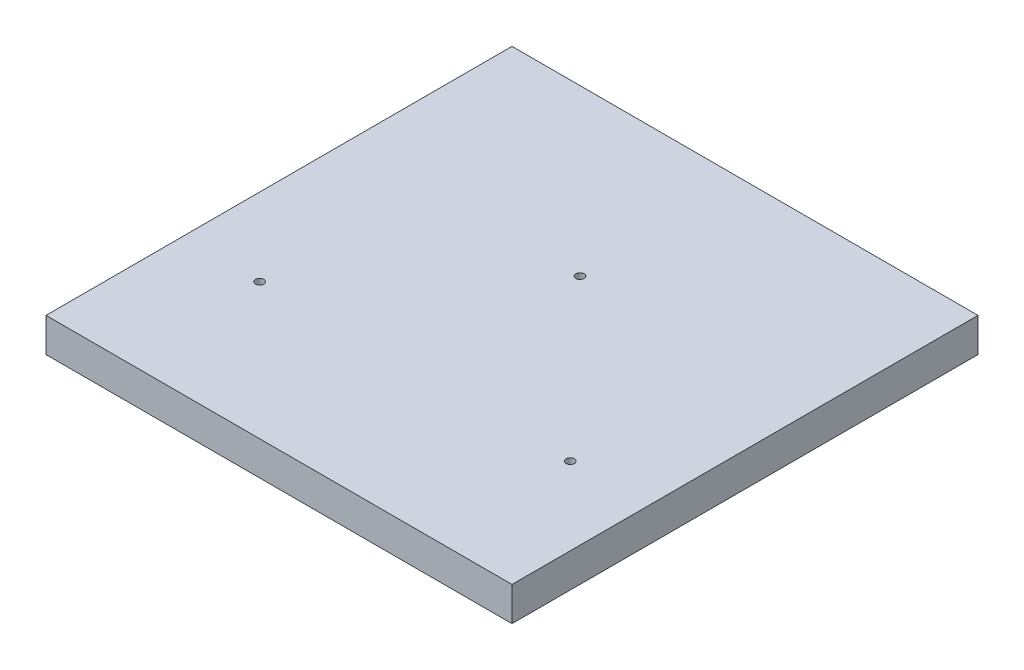
ISO-10303-21;
HEADER;
FILE_DESCRIPTION(('STEP AP214'),'2;1');
FILE_NAME('part.step','',(''),(''),'','','');
FILE_SCHEMA(('AUTOMOTIVE_DESIGN { 1 0 10303 214 1 1 1 1 }'));
ENDSEC;
DATA;
#1=APPLICATION_CONTEXT('core data for automotive mechanical design processes');
#2=APPLICATION_PROTOCOL_DEFINITION('international standard','automotive_design',2000,#1);
#3=PRODUCT_CONTEXT('',#1,'mechanical');
#4=PRODUCT('Part','Part','',(#3));
#5=PRODUCT_RELATED_PRODUCT_CATEGORY('part','',(#4));
#6=PRODUCT_DEFINITION_FORMATION('','',#4);
#7=PRODUCT_DEFINITION_CONTEXT('part definition',#1,'design');
#8=PRODUCT_DEFINITION('design','',#6,#7);
#9=PRODUCT_DEFINITION_SHAPE('','',#8);
#10=(LENGTH_UNIT() NAMED_UNIT(*) SI_UNIT(.MILLI.,.METRE.));
#11=(NAMED_UNIT(*) PLANE_ANGLE_UNIT() SI_UNIT($,.RADIAN.));
#12=(NAMED_UNIT(*) SI_UNIT($,.STERADIAN.) SOLID_ANGLE_UNIT());
#13=UNCERTAINTY_MEASURE_WITH_UNIT(LENGTH_MEASURE(1.E-05),#10,'distance_accuracy_value','');
#14=(GEOMETRIC_REPRESENTATION_CONTEXT(3) GLOBAL_UNCERTAINTY_ASSIGNED_CONTEXT((#13)) GLOBAL_UNIT_ASSIGNED_CONTEXT((#10,
#11,#12)) REPRESENTATION_CONTEXT('',''));
#15=CARTESIAN_POINT('',(0.,0.,0.));
#16=DIRECTION('',(0.,0.,1.));
#17=DIRECTION('',(1.,0.,0.));
#18=AXIS2_PLACEMENT_3D('',#15,#16,#17);
#19=CARTESIAN_POINT('',(-76.2,-5.55625,76.2));
#20=DIRECTION('',(1.,0.,0.));
#21=DIRECTION('',(0.,0.,-1.));
#22=AXIS2_PLACEMENT_3D('',#19,#20,#21);
#23=PLANE('',#22);
#24=DIRECTION('',(0.,-1.,0.));
#25=VECTOR('',#24,1.);
#26=CARTESIAN_POINT('',(-76.2,-5.55625,-76.2));
#27=LINE('',#26,#25);
#28=CARTESIAN_POINT('',(-76.2,5.55625,-76.2));
#29=VERTEX_POINT('',#28);
#30=CARTESIAN_POINT('',(-76.2,-5.55625,-76.2));
#31=VERTEX_POINT('',#30);
#32=EDGE_CURVE('E118',#29,#31,#27,.T.);
#33=ORIENTED_EDGE('',*,*,#32,.T.);
#34=DIRECTION('',(0.,0.,-1.));
#35=VECTOR('',#34,1.);
#36=CARTESIAN_POINT('',(-76.2,-5.55625,76.2));
#37=LINE('',#36,#35);
#38=CARTESIAN_POINT('',(-76.2,-5.55625,76.2));
#39=VERTEX_POINT('',#38);
#40=EDGE_CURVE('E11',#39,#31,#37,.T.);
#41=ORIENTED_EDGE('',*,*,#40,.F.);
#42=DIRECTION('',(0.,-1.,0.));
#43=VECTOR('',#42,1.);
#44=CARTESIAN_POINT('',(-76.2,-5.55625,76.2));
#45=LINE('',#44,#43);
#46=CARTESIAN_POINT('',(-76.2,5.55625,76.2));
#47=VERTEX_POINT('',#46);
#48=EDGE_CURVE('E102',#47,#39,#45,.T.);
#49=ORIENTED_EDGE('',*,*,#48,.F.);
#50=DIRECTION('',(0.,0.,-1.));
#51=VECTOR('',#50,1.);
#52=CARTESIAN_POINT('',(-76.2,5.55625,76.2));
#53=LINE('',#52,#51);
#54=EDGE_CURVE('E114',#47,#29,#53,.T.);
#55=ORIENTED_EDGE('',*,*,#54,.T.);
#56=EDGE_LOOP('',(#33,#41,#49,#55));
#57=FACE_BOUND('',#56,.T.);
#58=ADVANCED_FACE('F50',(#57),#23,.F.);
#59=CARTESIAN_POINT('',(76.2,-5.55625,76.2));
#60=DIRECTION('',(0.,1.,0.));
#61=DIRECTION('',(0.,0.,1.));
#62=AXIS2_PLACEMENT_3D('',#59,#60,#61);
#63=PLANE('',#62);
#64=CARTESIAN_POINT('',(0.,-5.55625,-22.2235425877767));
#65=DIRECTION('',(0.,1.,0.));
#66=DIRECTION('',(0.,0.,1.));
#67=AXIS2_PLACEMENT_3D('',#64,#65,#66);
#68=CIRCLE('',#67,1.35255);
#69=CARTESIAN_POINT('',(0.,-5.55625,-20.8709925877767));
#70=VERTEX_POINT('',#69);
#71=EDGE_CURVE('E154',#70,#70,#68,.T.);
#72=ORIENTED_EDGE('',*,*,#71,.T.);
#73=EDGE_LOOP('',(#72));
#74=FACE_BOUND('',#73,.T.);
#75=CARTESIAN_POINT('',(50.7999999999999,-5.55625,31.75));
#76=DIRECTION('',(0.,1.,0.));
#77=DIRECTION('',(0.,0.,1.));
#78=AXIS2_PLACEMENT_3D('',#75,#76,#77);
#79=CIRCLE('',#78,1.35254999999999);
#80=CARTESIAN_POINT('',(50.7999999999999,-5.55625,33.10255));
#81=VERTEX_POINT('',#80);
#82=EDGE_CURVE('E146',#81,#81,#79,.T.);
#83=ORIENTED_EDGE('',*,*,#82,.T.);
#84=EDGE_LOOP('',(#83));
#85=FACE_BOUND('',#84,.T.);
#86=CARTESIAN_POINT('',(-50.8000000000001,-5.55625,31.75));
#87=DIRECTION('',(0.,1.,0.));
#88=DIRECTION('',(0.,0.,1.));
#89=AXIS2_PLACEMENT_3D('',#86,#87,#88);
#90=CIRCLE('',#89,1.35254999999999);
#91=CARTESIAN_POINT('',(-50.8000000000001,-5.55625,33.10255));
#92=VERTEX_POINT('',#91);
#93=EDGE_CURVE('E122',#92,#92,#90,.T.);
#94=ORIENTED_EDGE('',*,*,#93,.T.);
#95=EDGE_LOOP('',(#94));
#96=FACE_BOUND('',#95,.T.);
#97=DIRECTION('',(1.,0.,0.));
#98=VECTOR('',#97,1.);
#99=CARTESIAN_POINT('',(76.2,-5.55625,-76.2));
#100=LINE('',#99,#98);
#101=CARTESIAN_POINT('',(76.2,-5.55625,-76.2));
#102=VERTEX_POINT('',#101);
#103=EDGE_CURVE('E107',#31,#102,#100,.T.);
#104=ORIENTED_EDGE('',*,*,#103,.T.);
#105=DIRECTION('',(0.,0.,-1.));
#106=VECTOR('',#105,1.);
#107=CARTESIAN_POINT('',(76.2,-5.55625,76.2));
#108=LINE('',#107,#106);
#109=CARTESIAN_POINT('',(76.2,-5.55625,76.2));
#110=VERTEX_POINT('',#109);
#111=EDGE_CURVE('E59',#110,#102,#108,.T.);
#112=ORIENTED_EDGE('',*,*,#111,.F.);
#113=DIRECTION('',(1.,0.,0.));
#114=VECTOR('',#113,1.);
#115=CARTESIAN_POINT('',(76.2,-5.55625,76.2));
#116=LINE('',#115,#114);
#117=EDGE_CURVE('E97',#39,#110,#116,.T.);
#118=ORIENTED_EDGE('',*,*,#117,.F.);
#119=ORIENTED_EDGE('',*,*,#40,.T.);
#120=EDGE_LOOP('',(#104,#112,#118,#119));
#121=FACE_BOUND('',#120,.T.);
#122=ADVANCED_FACE('F106',(#74,#85,#96,#121),#63,.F.);
#123=CARTESIAN_POINT('',(76.2,5.55625,76.2));
#124=DIRECTION('',(-1.,0.,0.));
#125=DIRECTION('',(0.,0.,1.));
#126=AXIS2_PLACEMENT_3D('',#123,#124,#125);
#127=PLANE('',#126);
#128=DIRECTION('',(0.,1.,0.));
#129=VECTOR('',#128,1.);
#130=CARTESIAN_POINT('',(76.2,5.55625,-76.2));
#131=LINE('',#130,#129);
#132=CARTESIAN_POINT('',(76.2,5.55625,-76.2));
#133=VERTEX_POINT('',#132);
#134=EDGE_CURVE('E84',#102,#133,#131,.T.);
#135=ORIENTED_EDGE('',*,*,#134,.T.);
#136=DIRECTION('',(0.,0.,-1.));
#137=VECTOR('',#136,1.);
#138=CARTESIAN_POINT('',(76.2,5.55625,76.2));
#139=LINE('',#138,#137);
#140=CARTESIAN_POINT('',(76.2,5.55625,76.2));
#141=VERTEX_POINT('',#140);
#142=EDGE_CURVE('E109',#141,#133,#139,.T.);
#143=ORIENTED_EDGE('',*,*,#142,.F.);
#144=DIRECTION('',(0.,1.,0.));
#145=VECTOR('',#144,1.);
#146=CARTESIAN_POINT('',(76.2,5.55625,76.2));
#147=LINE('',#146,#145);
#148=EDGE_CURVE('E100',#110,#141,#147,.T.);
#149=ORIENTED_EDGE('',*,*,#148,.F.);
#150=ORIENTED_EDGE('',*,*,#111,.T.);
#151=EDGE_LOOP('',(#135,#143,#149,#150));
#152=FACE_BOUND('',#151,.T.);
#153=ADVANCED_FACE('F110',(#152),#127,.F.);
#154=CARTESIAN_POINT('',(-76.2,5.55625,76.2));
#155=DIRECTION('',(0.,-1.,0.));
#156=DIRECTION('',(0.,0.,-1.));
#157=AXIS2_PLACEMENT_3D('',#154,#155,#156);
#158=PLANE('',#157);
#159=CARTESIAN_POINT('',(0.,5.55625,-22.2235425877767));
#160=DIRECTION('',(0.,1.,0.));
#161=DIRECTION('',(0.,0.,1.));
#162=AXIS2_PLACEMENT_3D('',#159,#160,#161);
#163=CIRCLE('',#162,1.35255);
#164=CARTESIAN_POINT('',(0.,5.55625,-20.8709925877767));
#165=VERTEX_POINT('',#164);
#166=EDGE_CURVE('E158',#165,#165,#163,.T.);
#167=ORIENTED_EDGE('',*,*,#166,.F.);
#168=EDGE_LOOP('',(#167));
#169=FACE_BOUND('',#168,.T.);
#170=CARTESIAN_POINT('',(50.7999999999999,5.55625,31.75));
#171=DIRECTION('',(0.,1.,0.));
#172=DIRECTION('',(0.,0.,1.));
#173=AXIS2_PLACEMENT_3D('',#170,#171,#172);
#174=CIRCLE('',#173,1.35255);
#175=CARTESIAN_POINT('',(50.7999999999999,5.55625,33.10255));
#176=VERTEX_POINT('',#175);
#177=EDGE_CURVE('E150',#176,#176,#174,.T.);
#178=ORIENTED_EDGE('',*,*,#177,.F.);
#179=EDGE_LOOP('',(#178));
#180=FACE_BOUND('',#179,.T.);
#181=CARTESIAN_POINT('',(-50.8000000000001,5.55625,31.75));
#182=DIRECTION('',(0.,1.,0.));
#183=DIRECTION('',(0.,0.,1.));
#184=AXIS2_PLACEMENT_3D('',#181,#182,#183);
#185=CIRCLE('',#184,1.35255);
#186=CARTESIAN_POINT('',(-50.8000000000001,5.55625,33.10255));
#187=VERTEX_POINT('',#186);
#188=EDGE_CURVE('E142',#187,#187,#185,.T.);
#189=ORIENTED_EDGE('',*,*,#188,.F.);
#190=EDGE_LOOP('',(#189));
#191=FACE_BOUND('',#190,.T.);
#192=DIRECTION('',(-1.,0.,0.));
#193=VECTOR('',#192,1.);
#194=CARTESIAN_POINT('',(-76.2,5.55625,-76.2));
#195=LINE('',#194,#193);
#196=EDGE_CURVE('E90',#133,#29,#195,.T.);
#197=ORIENTED_EDGE('',*,*,#196,.T.);
#198=ORIENTED_EDGE('',*,*,#54,.F.);
#199=DIRECTION('',(-1.,0.,0.));
#200=VECTOR('',#199,1.);
#201=CARTESIAN_POINT('',(-76.2,5.55625,76.2));
#202=LINE('',#201,#200);
#203=EDGE_CURVE('E67',#141,#47,#202,.T.);
#204=ORIENTED_EDGE('',*,*,#203,.F.);
#205=ORIENTED_EDGE('',*,*,#142,.T.);
#206=EDGE_LOOP('',(#197,#198,#204,#205));
#207=FACE_BOUND('',#206,.T.);
#208=ADVANCED_FACE('F132',(#169,#180,#191,#207),#158,.F.);
#209=CARTESIAN_POINT('',(0.,0.,76.2));
#210=DIRECTION('',(0.,0.,-1.));
#211=DIRECTION('',(-1.,0.,0.));
#212=AXIS2_PLACEMENT_3D('',#209,#210,#211);
#213=PLANE('',#212);
#214=ORIENTED_EDGE('',*,*,#48,.T.);
#215=ORIENTED_EDGE('',*,*,#117,.T.);
#216=ORIENTED_EDGE('',*,*,#148,.T.);
#217=ORIENTED_EDGE('',*,*,#203,.T.);
#218=EDGE_LOOP('',(#214,#215,#216,#217));
#219=FACE_BOUND('',#218,.T.);
#220=ADVANCED_FACE('F98',(#219),#213,.F.);
#221=CARTESIAN_POINT('',(0.,0.,-76.2));
#222=DIRECTION('',(0.,0.,-1.));
#223=DIRECTION('',(-1.,0.,0.));
#224=AXIS2_PLACEMENT_3D('',#221,#222,#223);
#225=PLANE('',#224);
#226=ORIENTED_EDGE('',*,*,#32,.F.);
#227=ORIENTED_EDGE('',*,*,#196,.F.);
#228=ORIENTED_EDGE('',*,*,#134,.F.);
#229=ORIENTED_EDGE('',*,*,#103,.F.);
#230=EDGE_LOOP('',(#226,#227,#228,#229));
#231=FACE_BOUND('',#230,.T.);
#232=ADVANCED_FACE('F135',(#231),#225,.T.);
#233=CARTESIAN_POINT('',(-50.8000000000001,5.55625,31.75));
#234=DIRECTION('',(0.,1.,0.));
#235=DIRECTION('',(0.,0.,1.));
#236=AXIS2_PLACEMENT_3D('',#233,#234,#235);
#237=CYLINDRICAL_SURFACE('',#236,1.35255);
#238=ORIENTED_EDGE('',*,*,#93,.F.);
#239=EDGE_LOOP('',(#238));
#240=FACE_BOUND('',#239,.T.);
#241=ORIENTED_EDGE('',*,*,#188,.T.);
#242=EDGE_LOOP('',(#241));
#243=FACE_BOUND('',#242,.T.);
#244=ADVANCED_FACE('F172',(#240,#243),#237,.F.);
#245=CARTESIAN_POINT('',(50.7999999999999,5.55625,31.75));
#246=DIRECTION('',(0.,1.,0.));
#247=DIRECTION('',(0.,0.,1.));
#248=AXIS2_PLACEMENT_3D('',#245,#246,#247);
#249=CYLINDRICAL_SURFACE('',#248,1.35255);
#250=ORIENTED_EDGE('',*,*,#82,.F.);
#251=EDGE_LOOP('',(#250));
#252=FACE_BOUND('',#251,.T.);
#253=ORIENTED_EDGE('',*,*,#177,.T.);
#254=EDGE_LOOP('',(#253));
#255=FACE_BOUND('',#254,.T.);
#256=ADVANCED_FACE('F174',(#252,#255),#249,.F.);
#257=CARTESIAN_POINT('',(0.,5.55625,-22.2235425877767));
#258=DIRECTION('',(0.,1.,0.));
#259=DIRECTION('',(0.,0.,1.));
#260=AXIS2_PLACEMENT_3D('',#257,#258,#259);
#261=CYLINDRICAL_SURFACE('',#260,1.35255);
#262=ORIENTED_EDGE('',*,*,#71,.F.);
#263=EDGE_LOOP('',(#262));
#264=FACE_BOUND('',#263,.T.);
#265=ORIENTED_EDGE('',*,*,#166,.T.);
#266=EDGE_LOOP('',(#265));
#267=FACE_BOUND('',#266,.T.);
#268=ADVANCED_FACE('F163',(#264,#267),#261,.F.);
#269=CLOSED_SHELL('',(#58,#122,#153,#208,#220,#232,#244,#256,#268));
#270=MANIFOLD_SOLID_BREP('B2',#269);
#271=ADVANCED_BREP_SHAPE_REPRESENTATION('',(#18,#270),#14);
#272=SHAPE_DEFINITION_REPRESENTATION(#9,#271);
ENDSEC;
END-ISO-10303-21;
